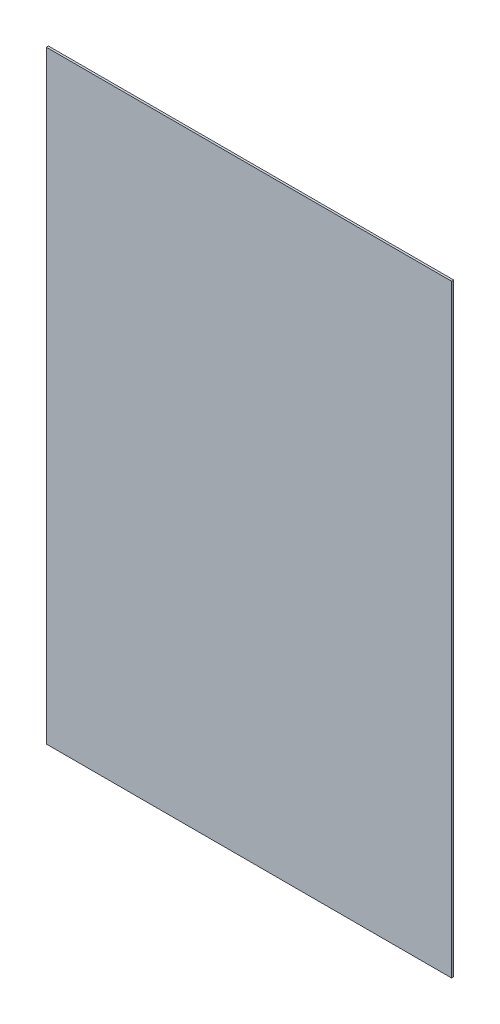
ISO-10303-21;
HEADER;
FILE_DESCRIPTION(('STEP AP214'),'2;1');
FILE_NAME('part.step','',(''),(''),'','','');
FILE_SCHEMA(('AUTOMOTIVE_DESIGN { 1 0 10303 214 1 1 1 1 }'));
ENDSEC;
DATA;
#1=APPLICATION_CONTEXT('core data for automotive mechanical design processes');
#2=APPLICATION_PROTOCOL_DEFINITION('international standard','automotive_design',2000,#1);
#3=PRODUCT_CONTEXT('',#1,'mechanical');
#4=PRODUCT('Part','Part','',(#3));
#5=PRODUCT_RELATED_PRODUCT_CATEGORY('part','',(#4));
#6=PRODUCT_DEFINITION_FORMATION('','',#4);
#7=PRODUCT_DEFINITION_CONTEXT('part definition',#1,'design');
#8=PRODUCT_DEFINITION('design','',#6,#7);
#9=PRODUCT_DEFINITION_SHAPE('','',#8);
#10=(LENGTH_UNIT() NAMED_UNIT(*) SI_UNIT(.MILLI.,.METRE.));
#11=(NAMED_UNIT(*) PLANE_ANGLE_UNIT() SI_UNIT($,.RADIAN.));
#12=(NAMED_UNIT(*) SI_UNIT($,.STERADIAN.) SOLID_ANGLE_UNIT());
#13=UNCERTAINTY_MEASURE_WITH_UNIT(LENGTH_MEASURE(1.E-05),#10,'distance_accuracy_value','');
#14=(GEOMETRIC_REPRESENTATION_CONTEXT(3) GLOBAL_UNCERTAINTY_ASSIGNED_CONTEXT((#13)) GLOBAL_UNIT_ASSIGNED_CONTEXT((#10,
#11,#12)) REPRESENTATION_CONTEXT('',''));
#15=CARTESIAN_POINT('',(0.,0.,0.));
#16=DIRECTION('',(0.,0.,1.));
#17=DIRECTION('',(1.,0.,0.));
#18=AXIS2_PLACEMENT_3D('',#15,#16,#17);
#19=CARTESIAN_POINT('',(-113.489999999997,9.50000000000003,1.2));
#20=DIRECTION('',(1.,0.,0.));
#21=DIRECTION('',(0.,1.,0.));
#22=AXIS2_PLACEMENT_3D('',#19,#20,#21);
#23=PLANE('',#22);
#24=DIRECTION('',(0.,-1.,0.));
#25=VECTOR('',#24,1.);
#26=CARTESIAN_POINT('',(-113.489999999997,9.50000000000003,0.));
#27=LINE('',#26,#25);
#28=CARTESIAN_POINT('',(-113.489999999997,9.50000000000003,0.));
#29=VERTEX_POINT('',#28);
#30=CARTESIAN_POINT('',(-113.489999999997,-328.5,0.));
#31=VERTEX_POINT('',#30);
#32=EDGE_CURVE('E100',#29,#31,#27,.T.);
#33=ORIENTED_EDGE('',*,*,#32,.T.);
#34=DIRECTION('',(0.,0.,-1.));
#35=VECTOR('',#34,1.);
#36=CARTESIAN_POINT('',(-113.489999999997,-328.5,1.2));
#37=LINE('',#36,#35);
#38=CARTESIAN_POINT('',(-113.489999999997,-328.5,1.2));
#39=VERTEX_POINT('',#38);
#40=EDGE_CURVE('E11',#39,#31,#37,.T.);
#41=ORIENTED_EDGE('',*,*,#40,.F.);
#42=DIRECTION('',(0.,-1.,0.));
#43=VECTOR('',#42,1.);
#44=CARTESIAN_POINT('',(-113.489999999997,9.50000000000003,1.2));
#45=LINE('',#44,#43);
#46=CARTESIAN_POINT('',(-113.489999999997,9.50000000000003,1.2));
#47=VERTEX_POINT('',#46);
#48=EDGE_CURVE('E88',#47,#39,#45,.T.);
#49=ORIENTED_EDGE('',*,*,#48,.F.);
#50=DIRECTION('',(0.,0.,-1.));
#51=VECTOR('',#50,1.);
#52=CARTESIAN_POINT('',(-113.489999999997,9.50000000000003,1.2));
#53=LINE('',#52,#51);
#54=EDGE_CURVE('E96',#47,#29,#53,.T.);
#55=ORIENTED_EDGE('',*,*,#54,.T.);
#56=EDGE_LOOP('',(#33,#41,#49,#55));
#57=FACE_BOUND('',#56,.T.);
#58=ADVANCED_FACE('F37',(#57),#23,.F.);
#59=CARTESIAN_POINT('',(-113.489999999997,-328.5,1.2));
#60=DIRECTION('',(0.,1.,0.));
#61=DIRECTION('',(0.,0.,1.));
#62=AXIS2_PLACEMENT_3D('',#59,#60,#61);
#63=PLANE('',#62);
#64=DIRECTION('',(1.,0.,0.));
#65=VECTOR('',#64,1.);
#66=CARTESIAN_POINT('',(-113.489999999997,-328.5,0.));
#67=LINE('',#66,#65);
#68=CARTESIAN_POINT('',(113.490000000003,-328.5,0.));
#69=VERTEX_POINT('',#68);
#70=EDGE_CURVE('E92',#31,#69,#67,.T.);
#71=ORIENTED_EDGE('',*,*,#70,.T.);
#72=DIRECTION('',(0.,0.,-1.));
#73=VECTOR('',#72,1.);
#74=CARTESIAN_POINT('',(113.490000000003,-328.5,1.2));
#75=LINE('',#74,#73);
#76=CARTESIAN_POINT('',(113.490000000003,-328.5,1.2));
#77=VERTEX_POINT('',#76);
#78=EDGE_CURVE('E45',#77,#69,#75,.T.);
#79=ORIENTED_EDGE('',*,*,#78,.F.);
#80=DIRECTION('',(1.,0.,0.));
#81=VECTOR('',#80,1.);
#82=CARTESIAN_POINT('',(-113.489999999997,-328.5,1.2));
#83=LINE('',#82,#81);
#84=EDGE_CURVE('E83',#39,#77,#83,.T.);
#85=ORIENTED_EDGE('',*,*,#84,.F.);
#86=ORIENTED_EDGE('',*,*,#40,.T.);
#87=EDGE_LOOP('',(#71,#79,#85,#86));
#88=FACE_BOUND('',#87,.T.);
#89=ADVANCED_FACE('F91',(#88),#63,.F.);
#90=CARTESIAN_POINT('',(113.490000000003,9.50000000000003,1.2));
#91=DIRECTION('',(-1.,0.,0.));
#92=DIRECTION('',(0.,-1.,0.));
#93=AXIS2_PLACEMENT_3D('',#90,#91,#92);
#94=PLANE('',#93);
#95=DIRECTION('',(0.,1.,0.));
#96=VECTOR('',#95,1.);
#97=CARTESIAN_POINT('',(113.490000000003,9.50000000000003,0.));
#98=LINE('',#97,#96);
#99=CARTESIAN_POINT('',(113.490000000003,9.50000000000003,0.));
#100=VERTEX_POINT('',#99);
#101=EDGE_CURVE('E70',#69,#100,#98,.T.);
#102=ORIENTED_EDGE('',*,*,#101,.T.);
#103=DIRECTION('',(0.,0.,-1.));
#104=VECTOR('',#103,1.);
#105=CARTESIAN_POINT('',(113.490000000003,9.50000000000003,1.2));
#106=LINE('',#105,#104);
#107=CARTESIAN_POINT('',(113.490000000003,9.50000000000003,1.2));
#108=VERTEX_POINT('',#107);
#109=EDGE_CURVE('E93',#108,#100,#106,.T.);
#110=ORIENTED_EDGE('',*,*,#109,.F.);
#111=DIRECTION('',(0.,1.,0.));
#112=VECTOR('',#111,1.);
#113=CARTESIAN_POINT('',(113.490000000003,9.50000000000003,1.2));
#114=LINE('',#113,#112);
#115=EDGE_CURVE('E86',#77,#108,#114,.T.);
#116=ORIENTED_EDGE('',*,*,#115,.F.);
#117=ORIENTED_EDGE('',*,*,#78,.T.);
#118=EDGE_LOOP('',(#102,#110,#116,#117));
#119=FACE_BOUND('',#118,.T.);
#120=ADVANCED_FACE('F94',(#119),#94,.F.);
#121=CARTESIAN_POINT('',(-113.489999999997,9.50000000000003,1.2));
#122=DIRECTION('',(0.,-1.,0.));
#123=DIRECTION('',(0.,0.,-1.));
#124=AXIS2_PLACEMENT_3D('',#121,#122,#123);
#125=PLANE('',#124);
#126=DIRECTION('',(-1.,0.,0.));
#127=VECTOR('',#126,1.);
#128=CARTESIAN_POINT('',(-113.489999999997,9.50000000000003,0.));
#129=LINE('',#128,#127);
#130=EDGE_CURVE('E76',#100,#29,#129,.T.);
#131=ORIENTED_EDGE('',*,*,#130,.T.);
#132=ORIENTED_EDGE('',*,*,#54,.F.);
#133=DIRECTION('',(-1.,0.,0.));
#134=VECTOR('',#133,1.);
#135=CARTESIAN_POINT('',(-113.489999999997,9.50000000000003,1.2));
#136=LINE('',#135,#134);
#137=EDGE_CURVE('E53',#108,#47,#136,.T.);
#138=ORIENTED_EDGE('',*,*,#137,.F.);
#139=ORIENTED_EDGE('',*,*,#109,.T.);
#140=EDGE_LOOP('',(#131,#132,#138,#139));
#141=FACE_BOUND('',#140,.T.);
#142=ADVANCED_FACE('F107',(#141),#125,.F.);
#143=CARTESIAN_POINT('',(0.,0.,1.2));
#144=DIRECTION('',(0.,0.,1.));
#145=DIRECTION('',(1.,0.,0.));
#146=AXIS2_PLACEMENT_3D('',#143,#144,#145);
#147=PLANE('',#146);
#148=ORIENTED_EDGE('',*,*,#48,.T.);
#149=ORIENTED_EDGE('',*,*,#84,.T.);
#150=ORIENTED_EDGE('',*,*,#115,.T.);
#151=ORIENTED_EDGE('',*,*,#137,.T.);
#152=EDGE_LOOP('',(#148,#149,#150,#151));
#153=FACE_BOUND('',#152,.T.);
#154=ADVANCED_FACE('F84',(#153),#147,.T.);
#155=CARTESIAN_POINT('',(0.,0.,0.));
#156=DIRECTION('',(0.,0.,1.));
#157=DIRECTION('',(1.,0.,0.));
#158=AXIS2_PLACEMENT_3D('',#155,#156,#157);
#159=PLANE('',#158);
#160=ORIENTED_EDGE('',*,*,#32,.F.);
#161=ORIENTED_EDGE('',*,*,#130,.F.);
#162=ORIENTED_EDGE('',*,*,#101,.F.);
#163=ORIENTED_EDGE('',*,*,#70,.F.);
#164=EDGE_LOOP('',(#160,#161,#162,#163));
#165=FACE_BOUND('',#164,.T.);
#166=ADVANCED_FACE('F110',(#165),#159,.F.);
#167=CLOSED_SHELL('',(#58,#89,#120,#142,#154,#166));
#168=MANIFOLD_SOLID_BREP('B2',#167);
#169=ADVANCED_BREP_SHAPE_REPRESENTATION('',(#18,#168),#14);
#170=SHAPE_DEFINITION_REPRESENTATION(#9,#169);
ENDSEC;
END-ISO-10303-21;
